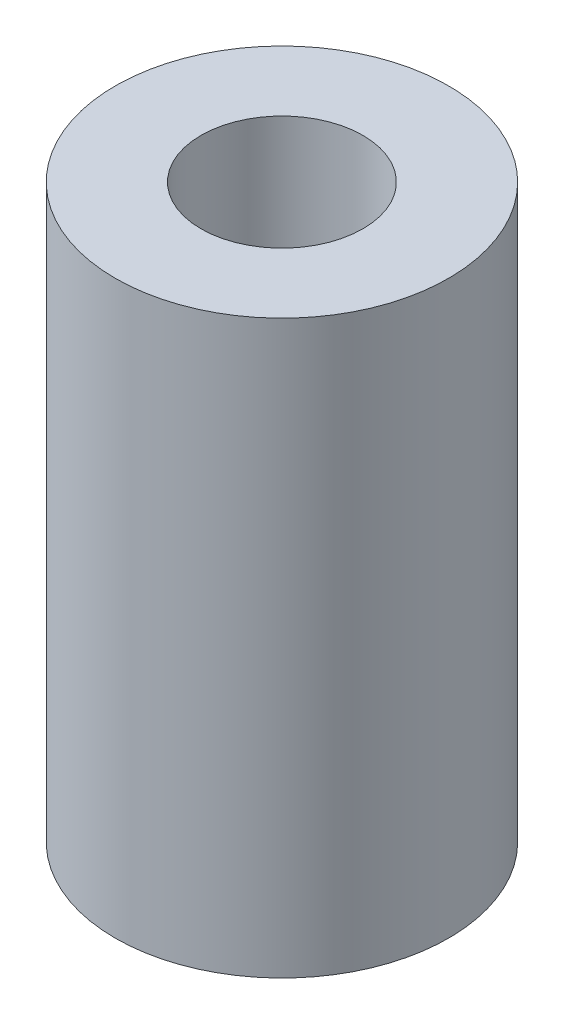
ISO-10303-21;
HEADER;
FILE_DESCRIPTION(('STEP AP214'),'2;1');
FILE_NAME('part.step','',(''),(''),'','','');
FILE_SCHEMA(('AUTOMOTIVE_DESIGN { 1 0 10303 214 1 1 1 1 }'));
ENDSEC;
DATA;
#1=APPLICATION_CONTEXT('core data for automotive mechanical design processes');
#2=APPLICATION_PROTOCOL_DEFINITION('international standard','automotive_design',2000,#1);
#3=PRODUCT_CONTEXT('',#1,'mechanical');
#4=PRODUCT('Part','Part','',(#3));
#5=PRODUCT_RELATED_PRODUCT_CATEGORY('part','',(#4));
#6=PRODUCT_DEFINITION_FORMATION('','',#4);
#7=PRODUCT_DEFINITION_CONTEXT('part definition',#1,'design');
#8=PRODUCT_DEFINITION('design','',#6,#7);
#9=PRODUCT_DEFINITION_SHAPE('','',#8);
#10=(LENGTH_UNIT() NAMED_UNIT(*) SI_UNIT(.MILLI.,.METRE.));
#11=(NAMED_UNIT(*) PLANE_ANGLE_UNIT() SI_UNIT($,.RADIAN.));
#12=(NAMED_UNIT(*) SI_UNIT($,.STERADIAN.) SOLID_ANGLE_UNIT());
#13=UNCERTAINTY_MEASURE_WITH_UNIT(LENGTH_MEASURE(1.E-05),#10,'distance_accuracy_value','');
#14=(GEOMETRIC_REPRESENTATION_CONTEXT(3) GLOBAL_UNCERTAINTY_ASSIGNED_CONTEXT((#13)) GLOBAL_UNIT_ASSIGNED_CONTEXT((#10,
#11,#12)) REPRESENTATION_CONTEXT('',''));
#15=CARTESIAN_POINT('',(0.,0.,0.));
#16=DIRECTION('',(0.,0.,1.));
#17=DIRECTION('',(1.,0.,0.));
#18=AXIS2_PLACEMENT_3D('',#15,#16,#17);
#19=CARTESIAN_POINT('',(0.,12.,0.));
#20=DIRECTION('',(0.,1.,0.));
#21=DIRECTION('',(0.,0.,1.));
#22=AXIS2_PLACEMENT_3D('',#19,#20,#21);
#23=PLANE('',#22);
#24=CARTESIAN_POINT('',(0.,12.,0.));
#25=DIRECTION('',(0.,1.,0.));
#26=DIRECTION('',(0.,0.,1.));
#27=AXIS2_PLACEMENT_3D('',#24,#25,#26);
#28=CIRCLE('',#27,3.5);
#29=CARTESIAN_POINT('',(0.,12.,3.5));
#30=VERTEX_POINT('',#29);
#31=EDGE_CURVE('E11',#30,#30,#28,.T.);
#32=ORIENTED_EDGE('',*,*,#31,.T.);
#33=EDGE_LOOP('',(#32));
#34=FACE_BOUND('',#33,.T.);
#35=CARTESIAN_POINT('',(0.,12.,0.));
#36=DIRECTION('',(0.,1.,0.));
#37=DIRECTION('',(0.,0.,1.));
#38=AXIS2_PLACEMENT_3D('',#35,#36,#37);
#39=CIRCLE('',#38,1.7);
#40=CARTESIAN_POINT('',(0.,12.,1.7));
#41=VERTEX_POINT('',#40);
#42=EDGE_CURVE('E47',#41,#41,#39,.T.);
#43=ORIENTED_EDGE('',*,*,#42,.F.);
#44=EDGE_LOOP('',(#43));
#45=FACE_BOUND('',#44,.T.);
#46=ADVANCED_FACE('F36',(#34,#45),#23,.T.);
#47=CARTESIAN_POINT('',(0.,0.,0.));
#48=DIRECTION('',(0.,1.,0.));
#49=DIRECTION('',(0.,0.,1.));
#50=AXIS2_PLACEMENT_3D('',#47,#48,#49);
#51=PLANE('',#50);
#52=CARTESIAN_POINT('',(0.,0.,0.));
#53=DIRECTION('',(0.,1.,0.));
#54=DIRECTION('',(0.,0.,1.));
#55=AXIS2_PLACEMENT_3D('',#52,#53,#54);
#56=CIRCLE('',#55,3.5);
#57=CARTESIAN_POINT('',(0.,0.,3.5));
#58=VERTEX_POINT('',#57);
#59=EDGE_CURVE('E40',#58,#58,#56,.T.);
#60=ORIENTED_EDGE('',*,*,#59,.F.);
#61=EDGE_LOOP('',(#60));
#62=FACE_BOUND('',#61,.T.);
#63=CARTESIAN_POINT('',(0.,0.,0.));
#64=DIRECTION('',(0.,1.,0.));
#65=DIRECTION('',(0.,0.,1.));
#66=AXIS2_PLACEMENT_3D('',#63,#64,#65);
#67=CIRCLE('',#66,1.7);
#68=CARTESIAN_POINT('',(0.,0.,1.7));
#69=VERTEX_POINT('',#68);
#70=EDGE_CURVE('E49',#69,#69,#67,.T.);
#71=ORIENTED_EDGE('',*,*,#70,.T.);
#72=EDGE_LOOP('',(#71));
#73=FACE_BOUND('',#72,.T.);
#74=ADVANCED_FACE('F59',(#62,#73),#51,.F.);
#75=CARTESIAN_POINT('',(0.,12.,0.));
#76=DIRECTION('',(0.,-1.,0.));
#77=DIRECTION('',(0.,0.,-1.));
#78=AXIS2_PLACEMENT_3D('',#75,#76,#77);
#79=CYLINDRICAL_SURFACE('',#78,3.5);
#80=ORIENTED_EDGE('',*,*,#31,.F.);
#81=EDGE_LOOP('',(#80));
#82=FACE_BOUND('',#81,.T.);
#83=ORIENTED_EDGE('',*,*,#59,.T.);
#84=EDGE_LOOP('',(#83));
#85=FACE_BOUND('',#84,.T.);
#86=ADVANCED_FACE('F38',(#82,#85),#79,.T.);
#87=CARTESIAN_POINT('',(0.,12.,0.));
#88=DIRECTION('',(0.,-1.,0.));
#89=DIRECTION('',(0.,0.,-1.));
#90=AXIS2_PLACEMENT_3D('',#87,#88,#89);
#91=CYLINDRICAL_SURFACE('',#90,1.7);
#92=ORIENTED_EDGE('',*,*,#42,.T.);
#93=EDGE_LOOP('',(#92));
#94=FACE_BOUND('',#93,.T.);
#95=ORIENTED_EDGE('',*,*,#70,.F.);
#96=EDGE_LOOP('',(#95));
#97=FACE_BOUND('',#96,.T.);
#98=ADVANCED_FACE('F55',(#94,#97),#91,.F.);
#99=CLOSED_SHELL('',(#46,#74,#86,#98));
#100=MANIFOLD_SOLID_BREP('B2',#99);
#101=ADVANCED_BREP_SHAPE_REPRESENTATION('',(#18,#100),#14);
#102=SHAPE_DEFINITION_REPRESENTATION(#9,#101);
ENDSEC;
END-ISO-10303-21;
